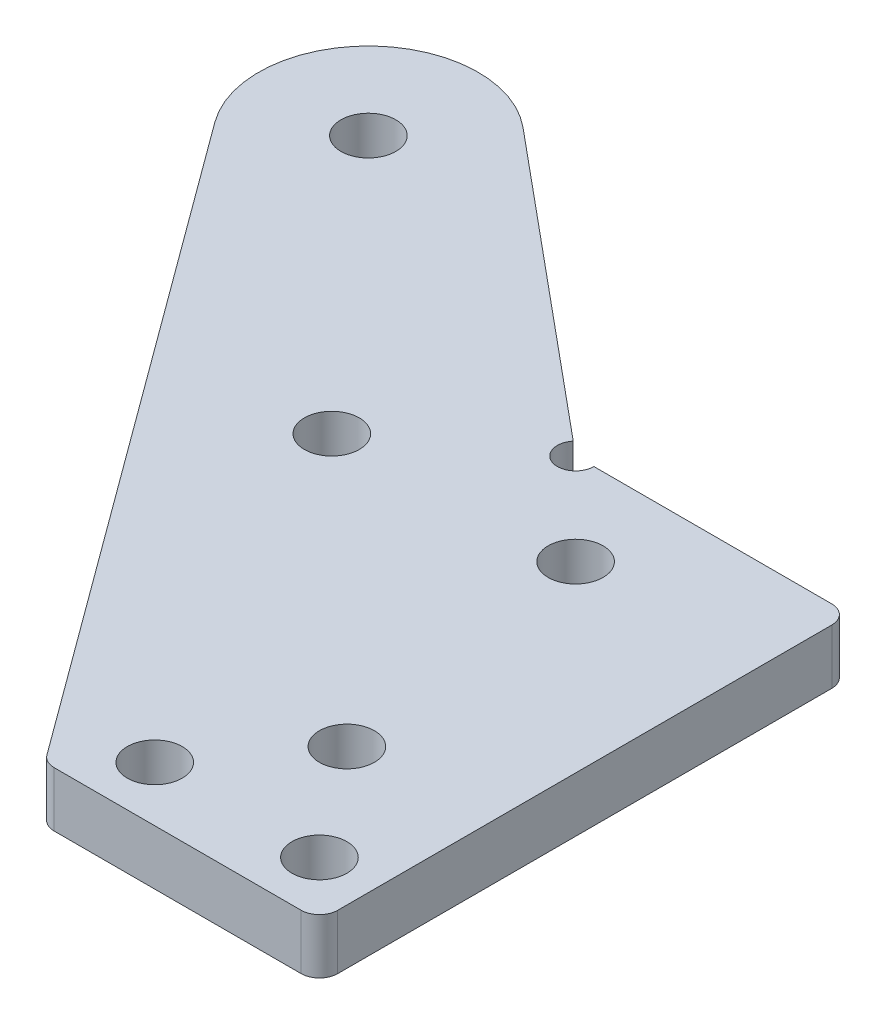
ISO-10303-21;
HEADER;
FILE_DESCRIPTION(('STEP AP214'),'2;1');
FILE_NAME('part.step','',(''),(''),'','','');
FILE_SCHEMA(('AUTOMOTIVE_DESIGN { 1 0 10303 214 1 1 1 1 }'));
ENDSEC;
DATA;
#1=APPLICATION_CONTEXT('core data for automotive mechanical design processes');
#2=APPLICATION_PROTOCOL_DEFINITION('international standard','automotive_design',2000,#1);
#3=PRODUCT_CONTEXT('',#1,'mechanical');
#4=PRODUCT('Part','Part','',(#3));
#5=PRODUCT_RELATED_PRODUCT_CATEGORY('part','',(#4));
#6=PRODUCT_DEFINITION_FORMATION('','',#4);
#7=PRODUCT_DEFINITION_CONTEXT('part definition',#1,'design');
#8=PRODUCT_DEFINITION('design','',#6,#7);
#9=PRODUCT_DEFINITION_SHAPE('','',#8);
#10=(LENGTH_UNIT() NAMED_UNIT(*) SI_UNIT(.MILLI.,.METRE.));
#11=(NAMED_UNIT(*) PLANE_ANGLE_UNIT() SI_UNIT($,.RADIAN.));
#12=(NAMED_UNIT(*) SI_UNIT($,.STERADIAN.) SOLID_ANGLE_UNIT());
#13=UNCERTAINTY_MEASURE_WITH_UNIT(LENGTH_MEASURE(1.E-05),#10,'distance_accuracy_value','');
#14=(GEOMETRIC_REPRESENTATION_CONTEXT(3) GLOBAL_UNCERTAINTY_ASSIGNED_CONTEXT((#13)) GLOBAL_UNIT_ASSIGNED_CONTEXT((#10,
#11,#12)) REPRESENTATION_CONTEXT('',''));
#15=CARTESIAN_POINT('',(0.,0.,0.));
#16=DIRECTION('',(0.,0.,1.));
#17=DIRECTION('',(1.,0.,0.));
#18=AXIS2_PLACEMENT_3D('',#15,#16,#17);
#19=CARTESIAN_POINT('',(-111.825081254808,3.,-50.));
#20=DIRECTION('',(0.,1.,0.));
#21=DIRECTION('',(0.,0.,1.));
#22=AXIS2_PLACEMENT_3D('',#19,#20,#21);
#23=PLANE('',#22);
#24=DIRECTION('',(0.59184614560801,0.,0.806050953680313));
#25=VECTOR('',#24,1.);
#26=CARTESIAN_POINT('',(-116.66138697689,3.,-46.4489231263519));
#27=LINE('',#26,#25);
#28=CARTESIAN_POINT('',(-116.66138697689,3.,-46.4489231263519));
#29=VERTEX_POINT('',#28);
#30=CARTESIAN_POINT('',(-91.2996886045901,3.,-11.908153854392));
#31=VERTEX_POINT('',#30);
#32=EDGE_CURVE('E320',#29,#31,#27,.T.);
#33=ORIENTED_EDGE('',*,*,#32,.T.);
#34=CARTESIAN_POINT('',(-90.4936376509097,3.,-12.5));
#35=DIRECTION('',(0.,1.,0.));
#36=DIRECTION('',(0.,0.,1.));
#37=AXIS2_PLACEMENT_3D('',#34,#35,#36);
#38=CIRCLE('',#37,1.);
#39=CARTESIAN_POINT('',(-90.4936376509097,3.,-11.5));
#40=VERTEX_POINT('',#39);
#41=EDGE_CURVE('E265',#31,#40,#38,.T.);
#42=ORIENTED_EDGE('',*,*,#41,.T.);
#43=DIRECTION('',(1.,0.,0.));
#44=VECTOR('',#43,1.);
#45=CARTESIAN_POINT('',(-76.,3.,-11.5));
#46=LINE('',#45,#44);
#47=CARTESIAN_POINT('',(-77.,3.,-11.5));
#48=VERTEX_POINT('',#47);
#49=EDGE_CURVE('E287',#40,#48,#46,.T.);
#50=ORIENTED_EDGE('',*,*,#49,.T.);
#51=CARTESIAN_POINT('',(-77.,3.,-12.5));
#52=DIRECTION('',(0.,1.,0.));
#53=DIRECTION('',(0.,0.,1.));
#54=AXIS2_PLACEMENT_3D('',#51,#52,#53);
#55=CIRCLE('',#54,1.);
#56=CARTESIAN_POINT('',(-76.,3.,-12.5));
#57=VERTEX_POINT('',#56);
#58=EDGE_CURVE('E261',#48,#57,#55,.T.);
#59=ORIENTED_EDGE('',*,*,#58,.T.);
#60=DIRECTION('',(0.,0.,-1.));
#61=VECTOR('',#60,1.);
#62=CARTESIAN_POINT('',(-76.,3.,-40.5));
#63=LINE('',#62,#61);
#64=CARTESIAN_POINT('',(-76.,3.,-39.5));
#65=VERTEX_POINT('',#64);
#66=EDGE_CURVE('E283',#57,#65,#63,.T.);
#67=ORIENTED_EDGE('',*,*,#66,.T.);
#68=CARTESIAN_POINT('',(-77.,3.,-39.5));
#69=DIRECTION('',(0.,1.,0.));
#70=DIRECTION('',(0.,0.,1.));
#71=AXIS2_PLACEMENT_3D('',#68,#69,#70);
#72=CIRCLE('',#71,1.);
#73=CARTESIAN_POINT('',(-77.,3.,-40.5));
#74=VERTEX_POINT('',#73);
#75=EDGE_CURVE('E63',#65,#74,#72,.T.);
#76=ORIENTED_EDGE('',*,*,#75,.T.);
#77=DIRECTION('',(-1.,0.,0.));
#78=VECTOR('',#77,1.);
#79=CARTESIAN_POINT('',(-91.,3.,-40.5));
#80=LINE('',#79,#78);
#81=CARTESIAN_POINT('',(-90.,3.,-40.5));
#82=VERTEX_POINT('',#81);
#83=EDGE_CURVE('E125',#74,#82,#80,.T.);
#84=ORIENTED_EDGE('',*,*,#83,.T.);
#85=CARTESIAN_POINT('',(-91.,3.,-40.5));
#86=DIRECTION('',(0.,1.,0.));
#87=DIRECTION('',(0.,0.,1.));
#88=AXIS2_PLACEMENT_3D('',#85,#86,#87);
#89=CIRCLE('',#88,0.999999999999998);
#90=CARTESIAN_POINT('',(-91.7691998766931,3.,-41.1390082547943));
#91=VERTEX_POINT('',#90);
#92=EDGE_CURVE('E129',#91,#82,#89,.T.);
#93=ORIENTED_EDGE('',*,*,#92,.F.);
#94=DIRECTION('',(-0.769199876693136,0.,-0.639008254794306));
#95=VECTOR('',#94,1.);
#96=CARTESIAN_POINT('',(-107.991031726043,3.,-54.6151992601588));
#97=LINE('',#96,#95);
#98=CARTESIAN_POINT('',(-107.991031726043,3.,-54.6151992601588));
#99=VERTEX_POINT('',#98);
#100=EDGE_CURVE('E134',#91,#99,#97,.T.);
#101=ORIENTED_EDGE('',*,*,#100,.T.);
#102=CARTESIAN_POINT('',(-111.825081254808,3.,-50.));
#103=DIRECTION('',(0.,1.,0.));
#104=DIRECTION('',(0.,0.,1.));
#105=AXIS2_PLACEMENT_3D('',#102,#103,#104);
#106=CIRCLE('',#105,5.99999999999999);
#107=EDGE_CURVE('E325',#99,#29,#106,.T.);
#108=ORIENTED_EDGE('',*,*,#107,.T.);
#109=EDGE_LOOP('',(#33,#42,#50,#59,#67,#76,#84,#93,#101,#108));
#110=FACE_BOUND('',#109,.T.);
#111=CARTESIAN_POINT('',(-98.7174576696489,3.,-34.8940341603137));
#112=DIRECTION('',(0.,1.,0.));
#113=DIRECTION('',(0.,0.,1.));
#114=AXIS2_PLACEMENT_3D('',#111,#112,#113);
#115=CIRCLE('',#114,1.5);
#116=CARTESIAN_POINT('',(-98.7174576696489,3.,-33.3940341603137));
#117=VERTEX_POINT('',#116);
#118=EDGE_CURVE('E160',#117,#117,#115,.T.);
#119=ORIENTED_EDGE('',*,*,#118,.F.);
#120=EDGE_LOOP('',(#119));
#121=FACE_BOUND('',#120,.T.);
#122=CARTESIAN_POINT('',(-83.5,3.,-20.5));
#123=DIRECTION('',(0.,1.,0.));
#124=DIRECTION('',(0.,0.,1.));
#125=AXIS2_PLACEMENT_3D('',#122,#123,#124);
#126=CIRCLE('',#125,1.5);
#127=CARTESIAN_POINT('',(-83.5,3.,-19.));
#128=VERTEX_POINT('',#127);
#129=EDGE_CURVE('E175',#128,#128,#126,.T.);
#130=ORIENTED_EDGE('',*,*,#129,.F.);
#131=EDGE_LOOP('',(#130));
#132=FACE_BOUND('',#131,.T.);
#133=CARTESIAN_POINT('',(-88.,3.,-14.5));
#134=DIRECTION('',(0.,1.,0.));
#135=DIRECTION('',(0.,0.,1.));
#136=AXIS2_PLACEMENT_3D('',#133,#134,#135);
#137=CIRCLE('',#136,1.5);
#138=CARTESIAN_POINT('',(-88.,3.,-13.));
#139=VERTEX_POINT('',#138);
#140=EDGE_CURVE('E292',#139,#139,#137,.T.);
#141=ORIENTED_EDGE('',*,*,#140,.F.);
#142=EDGE_LOOP('',(#141));
#143=FACE_BOUND('',#142,.T.);
#144=CARTESIAN_POINT('',(-79.,3.,-14.5));
#145=DIRECTION('',(0.,1.,0.));
#146=DIRECTION('',(0.,0.,1.));
#147=AXIS2_PLACEMENT_3D('',#144,#145,#146);
#148=CIRCLE('',#147,1.5);
#149=CARTESIAN_POINT('',(-79.,3.,-13.));
#150=VERTEX_POINT('',#149);
#151=EDGE_CURVE('E185',#150,#150,#148,.T.);
#152=ORIENTED_EDGE('',*,*,#151,.F.);
#153=EDGE_LOOP('',(#152));
#154=FACE_BOUND('',#153,.T.);
#155=CARTESIAN_POINT('',(-86.,3.,-35.5));
#156=DIRECTION('',(0.,1.,0.));
#157=DIRECTION('',(0.,0.,1.));
#158=AXIS2_PLACEMENT_3D('',#155,#156,#157);
#159=CIRCLE('',#158,1.5);
#160=CARTESIAN_POINT('',(-86.,3.,-34.));
#161=VERTEX_POINT('',#160);
#162=EDGE_CURVE('E184',#161,#161,#159,.T.);
#163=ORIENTED_EDGE('',*,*,#162,.F.);
#164=EDGE_LOOP('',(#163));
#165=FACE_BOUND('',#164,.T.);
#166=CARTESIAN_POINT('',(-111.825081254808,3.,-50.));
#167=DIRECTION('',(0.,1.,0.));
#168=DIRECTION('',(0.,0.,1.));
#169=AXIS2_PLACEMENT_3D('',#166,#167,#168);
#170=CIRCLE('',#169,1.5);
#171=CARTESIAN_POINT('',(-111.825081254808,3.,-48.5));
#172=VERTEX_POINT('',#171);
#173=EDGE_CURVE('E152',#172,#172,#170,.T.);
#174=ORIENTED_EDGE('',*,*,#173,.F.);
#175=EDGE_LOOP('',(#174));
#176=FACE_BOUND('',#175,.T.);
#177=ADVANCED_FACE('F48',(#110,#121,#132,#143,#154,#165,#176),#23,.T.);
#178=CARTESIAN_POINT('',(-111.825081254808,0.,-50.));
#179=DIRECTION('',(0.,1.,0.));
#180=DIRECTION('',(0.,0.,1.));
#181=AXIS2_PLACEMENT_3D('',#178,#179,#180);
#182=PLANE('',#181);
#183=DIRECTION('',(1.,0.,0.));
#184=VECTOR('',#183,1.);
#185=CARTESIAN_POINT('',(-76.,0.,-11.5));
#186=LINE('',#185,#184);
#187=CARTESIAN_POINT('',(-90.4936376509097,0.,-11.5));
#188=VERTEX_POINT('',#187);
#189=CARTESIAN_POINT('',(-77.,0.,-11.5));
#190=VERTEX_POINT('',#189);
#191=EDGE_CURVE('E299',#188,#190,#186,.T.);
#192=ORIENTED_EDGE('',*,*,#191,.F.);
#193=CARTESIAN_POINT('',(-90.4936376509097,0.,-12.5));
#194=DIRECTION('',(0.,1.,0.));
#195=DIRECTION('',(0.,0.,1.));
#196=AXIS2_PLACEMENT_3D('',#193,#194,#195);
#197=CIRCLE('',#196,1.);
#198=CARTESIAN_POINT('',(-91.2996886045901,0.,-11.908153854392));
#199=VERTEX_POINT('',#198);
#200=EDGE_CURVE('E317',#188,#199,#197,.F.);
#201=ORIENTED_EDGE('',*,*,#200,.T.);
#202=DIRECTION('',(0.59184614560801,0.,0.806050953680313));
#203=VECTOR('',#202,1.);
#204=CARTESIAN_POINT('',(-116.66138697689,0.,-46.4489231263519));
#205=LINE('',#204,#203);
#206=CARTESIAN_POINT('',(-116.66138697689,0.,-46.4489231263519));
#207=VERTEX_POINT('',#206);
#208=EDGE_CURVE('E296',#207,#199,#205,.T.);
#209=ORIENTED_EDGE('',*,*,#208,.F.);
#210=CARTESIAN_POINT('',(-111.825081254808,0.,-50.));
#211=DIRECTION('',(0.,1.,0.));
#212=DIRECTION('',(0.,0.,1.));
#213=AXIS2_PLACEMENT_3D('',#210,#211,#212);
#214=CIRCLE('',#213,5.99999999999999);
#215=CARTESIAN_POINT('',(-107.991031726043,0.,-54.6151992601588));
#216=VERTEX_POINT('',#215);
#217=EDGE_CURVE('E294',#216,#207,#214,.T.);
#218=ORIENTED_EDGE('',*,*,#217,.F.);
#219=DIRECTION('',(-0.769199876693136,0.,-0.639008254794306));
#220=VECTOR('',#219,1.);
#221=CARTESIAN_POINT('',(-107.991031726043,0.,-54.6151992601588));
#222=LINE('',#221,#220);
#223=CARTESIAN_POINT('',(-91.7691998766931,0.,-41.1390082547943));
#224=VERTEX_POINT('',#223);
#225=EDGE_CURVE('E291',#224,#216,#222,.T.);
#226=ORIENTED_EDGE('',*,*,#225,.F.);
#227=CARTESIAN_POINT('',(-91.,0.,-40.5));
#228=DIRECTION('',(0.,1.,0.));
#229=DIRECTION('',(0.,0.,1.));
#230=AXIS2_PLACEMENT_3D('',#227,#228,#229);
#231=CIRCLE('',#230,0.999999999999998);
#232=CARTESIAN_POINT('',(-90.,0.,-40.5));
#233=VERTEX_POINT('',#232);
#234=EDGE_CURVE('E144',#224,#233,#231,.T.);
#235=ORIENTED_EDGE('',*,*,#234,.T.);
#236=DIRECTION('',(-1.,0.,0.));
#237=VECTOR('',#236,1.);
#238=CARTESIAN_POINT('',(-91.,0.,-40.5));
#239=LINE('',#238,#237);
#240=CARTESIAN_POINT('',(-77.,0.,-40.5));
#241=VERTEX_POINT('',#240);
#242=EDGE_CURVE('E148',#241,#233,#239,.T.);
#243=ORIENTED_EDGE('',*,*,#242,.F.);
#244=CARTESIAN_POINT('',(-77.,0.,-39.5));
#245=DIRECTION('',(0.,1.,0.));
#246=DIRECTION('',(0.,0.,1.));
#247=AXIS2_PLACEMENT_3D('',#244,#245,#246);
#248=CIRCLE('',#247,1.);
#249=CARTESIAN_POINT('',(-76.,0.,-39.5));
#250=VERTEX_POINT('',#249);
#251=EDGE_CURVE('E313',#241,#250,#248,.F.);
#252=ORIENTED_EDGE('',*,*,#251,.T.);
#253=DIRECTION('',(0.,0.,-1.));
#254=VECTOR('',#253,1.);
#255=CARTESIAN_POINT('',(-76.,0.,-40.5));
#256=LINE('',#255,#254);
#257=CARTESIAN_POINT('',(-76.,0.,-12.5));
#258=VERTEX_POINT('',#257);
#259=EDGE_CURVE('E135',#258,#250,#256,.T.);
#260=ORIENTED_EDGE('',*,*,#259,.F.);
#261=CARTESIAN_POINT('',(-77.,0.,-12.5));
#262=DIRECTION('',(0.,1.,0.));
#263=DIRECTION('',(0.,0.,1.));
#264=AXIS2_PLACEMENT_3D('',#261,#262,#263);
#265=CIRCLE('',#264,1.);
#266=EDGE_CURVE('E315',#258,#190,#265,.F.);
#267=ORIENTED_EDGE('',*,*,#266,.T.);
#268=EDGE_LOOP('',(#192,#201,#209,#218,#226,#235,#243,#252,#260,#267));
#269=FACE_BOUND('',#268,.T.);
#270=CARTESIAN_POINT('',(-88.,0.,-14.5));
#271=DIRECTION('',(0.,1.,0.));
#272=DIRECTION('',(0.,0.,1.));
#273=AXIS2_PLACEMENT_3D('',#270,#271,#272);
#274=CIRCLE('',#273,1.5);
#275=CARTESIAN_POINT('',(-88.,0.,-13.));
#276=VERTEX_POINT('',#275);
#277=EDGE_CURVE('E189',#276,#276,#274,.T.);
#278=ORIENTED_EDGE('',*,*,#277,.T.);
#279=EDGE_LOOP('',(#278));
#280=FACE_BOUND('',#279,.T.);
#281=CARTESIAN_POINT('',(-79.,0.,-14.5));
#282=DIRECTION('',(0.,1.,0.));
#283=DIRECTION('',(0.,0.,1.));
#284=AXIS2_PLACEMENT_3D('',#281,#282,#283);
#285=CIRCLE('',#284,1.5);
#286=CARTESIAN_POINT('',(-79.,0.,-13.));
#287=VERTEX_POINT('',#286);
#288=EDGE_CURVE('E180',#287,#287,#285,.T.);
#289=ORIENTED_EDGE('',*,*,#288,.T.);
#290=EDGE_LOOP('',(#289));
#291=FACE_BOUND('',#290,.T.);
#292=CARTESIAN_POINT('',(-83.5,0.,-20.5));
#293=DIRECTION('',(0.,1.,0.));
#294=DIRECTION('',(0.,0.,1.));
#295=AXIS2_PLACEMENT_3D('',#292,#293,#294);
#296=CIRCLE('',#295,1.5);
#297=CARTESIAN_POINT('',(-83.5,0.,-19.));
#298=VERTEX_POINT('',#297);
#299=EDGE_CURVE('E181',#298,#298,#296,.T.);
#300=ORIENTED_EDGE('',*,*,#299,.T.);
#301=EDGE_LOOP('',(#300));
#302=FACE_BOUND('',#301,.T.);
#303=CARTESIAN_POINT('',(-86.,0.,-35.5));
#304=DIRECTION('',(0.,1.,0.));
#305=DIRECTION('',(0.,0.,1.));
#306=AXIS2_PLACEMENT_3D('',#303,#304,#305);
#307=CIRCLE('',#306,1.5);
#308=CARTESIAN_POINT('',(-86.,0.,-34.));
#309=VERTEX_POINT('',#308);
#310=EDGE_CURVE('E164',#309,#309,#307,.T.);
#311=ORIENTED_EDGE('',*,*,#310,.T.);
#312=EDGE_LOOP('',(#311));
#313=FACE_BOUND('',#312,.T.);
#314=CARTESIAN_POINT('',(-98.7174576696489,0.,-34.8940341603137));
#315=DIRECTION('',(0.,1.,0.));
#316=DIRECTION('',(0.,0.,1.));
#317=AXIS2_PLACEMENT_3D('',#314,#315,#316);
#318=CIRCLE('',#317,1.5);
#319=CARTESIAN_POINT('',(-98.7174576696489,0.,-33.3940341603137));
#320=VERTEX_POINT('',#319);
#321=EDGE_CURVE('E158',#320,#320,#318,.T.);
#322=ORIENTED_EDGE('',*,*,#321,.T.);
#323=EDGE_LOOP('',(#322));
#324=FACE_BOUND('',#323,.T.);
#325=CARTESIAN_POINT('',(-111.825081254808,0.,-50.));
#326=DIRECTION('',(0.,1.,0.));
#327=DIRECTION('',(0.,0.,1.));
#328=AXIS2_PLACEMENT_3D('',#325,#326,#327);
#329=CIRCLE('',#328,1.5);
#330=CARTESIAN_POINT('',(-111.825081254808,0.,-48.5));
#331=VERTEX_POINT('',#330);
#332=EDGE_CURVE('E149',#331,#331,#329,.T.);
#333=ORIENTED_EDGE('',*,*,#332,.T.);
#334=EDGE_LOOP('',(#333));
#335=FACE_BOUND('',#334,.T.);
#336=ADVANCED_FACE('F197',(#269,#280,#291,#302,#313,#324,#335),#182,.F.);
#337=CARTESIAN_POINT('',(-91.,3.,-40.5));
#338=DIRECTION('',(0.,0.,1.));
#339=DIRECTION('',(1.,0.,0.));
#340=AXIS2_PLACEMENT_3D('',#337,#338,#339);
#341=PLANE('',#340);
#342=ORIENTED_EDGE('',*,*,#83,.F.);
#343=DIRECTION('',(0.,-1.,0.));
#344=VECTOR('',#343,1.);
#345=CARTESIAN_POINT('',(-77.,3.,-40.5));
#346=LINE('',#345,#344);
#347=EDGE_CURVE('E12',#74,#241,#346,.T.);
#348=ORIENTED_EDGE('',*,*,#347,.T.);
#349=ORIENTED_EDGE('',*,*,#242,.T.);
#350=DIRECTION('',(0.,1.,0.));
#351=VECTOR('',#350,1.);
#352=CARTESIAN_POINT('',(-90.,0.,-40.5));
#353=LINE('',#352,#351);
#354=EDGE_CURVE('E140',#233,#82,#353,.T.);
#355=ORIENTED_EDGE('',*,*,#354,.T.);
#356=EDGE_LOOP('',(#342,#348,#349,#355));
#357=FACE_BOUND('',#356,.T.);
#358=ADVANCED_FACE('F146',(#357),#341,.F.);
#359=CARTESIAN_POINT('',(-107.991031726043,3.,-54.6151992601588));
#360=DIRECTION('',(-0.639008254794306,0.,0.769199876693136));
#361=DIRECTION('',(0.769199876693136,0.,0.639008254794306));
#362=AXIS2_PLACEMENT_3D('',#359,#360,#361);
#363=PLANE('',#362);
#364=ORIENTED_EDGE('',*,*,#100,.F.);
#365=DIRECTION('',(0.,1.,0.));
#366=VECTOR('',#365,1.);
#367=CARTESIAN_POINT('',(-91.7691998766931,0.,-41.1390082547943));
#368=LINE('',#367,#366);
#369=EDGE_CURVE('E143',#91,#224,#368,.F.);
#370=ORIENTED_EDGE('',*,*,#369,.T.);
#371=ORIENTED_EDGE('',*,*,#225,.T.);
#372=DIRECTION('',(0.,-1.,0.));
#373=VECTOR('',#372,1.);
#374=CARTESIAN_POINT('',(-107.991031726043,3.,-54.6151992601588));
#375=LINE('',#374,#373);
#376=EDGE_CURVE('E305',#99,#216,#375,.T.);
#377=ORIENTED_EDGE('',*,*,#376,.F.);
#378=EDGE_LOOP('',(#364,#370,#371,#377));
#379=FACE_BOUND('',#378,.T.);
#380=ADVANCED_FACE('F241',(#379),#363,.F.);
#381=CARTESIAN_POINT('',(-111.825081254808,3.,-50.));
#382=DIRECTION('',(0.,-1.,0.));
#383=DIRECTION('',(0.,0.,-1.));
#384=AXIS2_PLACEMENT_3D('',#381,#382,#383);
#385=CYLINDRICAL_SURFACE('',#384,5.99999999999999);
#386=ORIENTED_EDGE('',*,*,#217,.T.);
#387=DIRECTION('',(0.,-1.,0.));
#388=VECTOR('',#387,1.);
#389=CARTESIAN_POINT('',(-116.66138697689,3.,-46.4489231263519));
#390=LINE('',#389,#388);
#391=EDGE_CURVE('E286',#29,#207,#390,.T.);
#392=ORIENTED_EDGE('',*,*,#391,.F.);
#393=ORIENTED_EDGE('',*,*,#107,.F.);
#394=ORIENTED_EDGE('',*,*,#376,.T.);
#395=EDGE_LOOP('',(#386,#392,#393,#394));
#396=FACE_BOUND('',#395,.T.);
#397=ADVANCED_FACE('F237',(#396),#385,.T.);
#398=CARTESIAN_POINT('',(-116.66138697689,3.,-46.4489231263519));
#399=DIRECTION('',(0.806050953680313,0.,-0.59184614560801));
#400=DIRECTION('',(-0.59184614560801,0.,-0.806050953680313));
#401=AXIS2_PLACEMENT_3D('',#398,#399,#400);
#402=PLANE('',#401);
#403=ORIENTED_EDGE('',*,*,#208,.T.);
#404=DIRECTION('',(0.,-1.,0.));
#405=VECTOR('',#404,1.);
#406=CARTESIAN_POINT('',(-91.29968860459,3.,-11.908153854392));
#407=LINE('',#406,#405);
#408=EDGE_CURVE('E268',#199,#31,#407,.F.);
#409=ORIENTED_EDGE('',*,*,#408,.T.);
#410=ORIENTED_EDGE('',*,*,#32,.F.);
#411=ORIENTED_EDGE('',*,*,#391,.T.);
#412=EDGE_LOOP('',(#403,#409,#410,#411));
#413=FACE_BOUND('',#412,.T.);
#414=ADVANCED_FACE('F233',(#413),#402,.F.);
#415=CARTESIAN_POINT('',(-76.,3.,-11.5));
#416=DIRECTION('',(0.,0.,-1.));
#417=DIRECTION('',(-1.,0.,0.));
#418=AXIS2_PLACEMENT_3D('',#415,#416,#417);
#419=PLANE('',#418);
#420=ORIENTED_EDGE('',*,*,#49,.F.);
#421=DIRECTION('',(0.,-1.,0.));
#422=VECTOR('',#421,1.);
#423=CARTESIAN_POINT('',(-90.4936376509097,3.,-11.5));
#424=LINE('',#423,#422);
#425=EDGE_CURVE('E310',#40,#188,#424,.T.);
#426=ORIENTED_EDGE('',*,*,#425,.T.);
#427=ORIENTED_EDGE('',*,*,#191,.T.);
#428=DIRECTION('',(0.,-1.,0.));
#429=VECTOR('',#428,1.);
#430=CARTESIAN_POINT('',(-77.,3.,-11.5));
#431=LINE('',#430,#429);
#432=EDGE_CURVE('E262',#190,#48,#431,.F.);
#433=ORIENTED_EDGE('',*,*,#432,.T.);
#434=EDGE_LOOP('',(#420,#426,#427,#433));
#435=FACE_BOUND('',#434,.T.);
#436=ADVANCED_FACE('F230',(#435),#419,.F.);
#437=CARTESIAN_POINT('',(-76.,3.,-40.5));
#438=DIRECTION('',(-1.,0.,0.));
#439=DIRECTION('',(0.,0.,1.));
#440=AXIS2_PLACEMENT_3D('',#437,#438,#439);
#441=PLANE('',#440);
#442=ORIENTED_EDGE('',*,*,#66,.F.);
#443=DIRECTION('',(0.,-1.,0.));
#444=VECTOR('',#443,1.);
#445=CARTESIAN_POINT('',(-76.,3.,-12.5));
#446=LINE('',#445,#444);
#447=EDGE_CURVE('E56',#57,#258,#446,.T.);
#448=ORIENTED_EDGE('',*,*,#447,.T.);
#449=ORIENTED_EDGE('',*,*,#259,.T.);
#450=DIRECTION('',(0.,-1.,0.));
#451=VECTOR('',#450,1.);
#452=CARTESIAN_POINT('',(-76.,3.,-39.5));
#453=LINE('',#452,#451);
#454=EDGE_CURVE('E71',#250,#65,#453,.F.);
#455=ORIENTED_EDGE('',*,*,#454,.T.);
#456=EDGE_LOOP('',(#442,#448,#449,#455));
#457=FACE_BOUND('',#456,.T.);
#458=ADVANCED_FACE('F227',(#457),#441,.F.);
#459=CARTESIAN_POINT('',(-88.,3.,-14.5));
#460=DIRECTION('',(0.,-1.,0.));
#461=DIRECTION('',(0.,0.,-1.));
#462=AXIS2_PLACEMENT_3D('',#459,#460,#461);
#463=CYLINDRICAL_SURFACE('',#462,1.5);
#464=ORIENTED_EDGE('',*,*,#140,.T.);
#465=EDGE_LOOP('',(#464));
#466=FACE_BOUND('',#465,.T.);
#467=ORIENTED_EDGE('',*,*,#277,.F.);
#468=EDGE_LOOP('',(#467));
#469=FACE_BOUND('',#468,.T.);
#470=ADVANCED_FACE('F224',(#466,#469),#463,.F.);
#471=CARTESIAN_POINT('',(-79.,3.,-14.5));
#472=DIRECTION('',(0.,-1.,0.));
#473=DIRECTION('',(0.,0.,-1.));
#474=AXIS2_PLACEMENT_3D('',#471,#472,#473);
#475=CYLINDRICAL_SURFACE('',#474,1.5);
#476=ORIENTED_EDGE('',*,*,#151,.T.);
#477=EDGE_LOOP('',(#476));
#478=FACE_BOUND('',#477,.T.);
#479=ORIENTED_EDGE('',*,*,#288,.F.);
#480=EDGE_LOOP('',(#479));
#481=FACE_BOUND('',#480,.T.);
#482=ADVANCED_FACE('F212',(#478,#481),#475,.F.);
#483=CARTESIAN_POINT('',(-83.5,3.,-20.5));
#484=DIRECTION('',(0.,-1.,0.));
#485=DIRECTION('',(0.,0.,-1.));
#486=AXIS2_PLACEMENT_3D('',#483,#484,#485);
#487=CYLINDRICAL_SURFACE('',#486,1.5);
#488=ORIENTED_EDGE('',*,*,#129,.T.);
#489=EDGE_LOOP('',(#488));
#490=FACE_BOUND('',#489,.T.);
#491=ORIENTED_EDGE('',*,*,#299,.F.);
#492=EDGE_LOOP('',(#491));
#493=FACE_BOUND('',#492,.T.);
#494=ADVANCED_FACE('F203',(#490,#493),#487,.F.);
#495=CARTESIAN_POINT('',(-86.,3.,-35.5));
#496=DIRECTION('',(0.,-1.,0.));
#497=DIRECTION('',(0.,0.,-1.));
#498=AXIS2_PLACEMENT_3D('',#495,#496,#497);
#499=CYLINDRICAL_SURFACE('',#498,1.5);
#500=ORIENTED_EDGE('',*,*,#162,.T.);
#501=EDGE_LOOP('',(#500));
#502=FACE_BOUND('',#501,.T.);
#503=ORIENTED_EDGE('',*,*,#310,.F.);
#504=EDGE_LOOP('',(#503));
#505=FACE_BOUND('',#504,.T.);
#506=ADVANCED_FACE('F200',(#502,#505),#499,.F.);
#507=CARTESIAN_POINT('',(-98.7174576696489,3.,-34.8940341603137));
#508=DIRECTION('',(0.,-1.,0.));
#509=DIRECTION('',(0.,0.,-1.));
#510=AXIS2_PLACEMENT_3D('',#507,#508,#509);
#511=CYLINDRICAL_SURFACE('',#510,1.5);
#512=ORIENTED_EDGE('',*,*,#118,.T.);
#513=EDGE_LOOP('',(#512));
#514=FACE_BOUND('',#513,.T.);
#515=ORIENTED_EDGE('',*,*,#321,.F.);
#516=EDGE_LOOP('',(#515));
#517=FACE_BOUND('',#516,.T.);
#518=ADVANCED_FACE('F202',(#514,#517),#511,.F.);
#519=CARTESIAN_POINT('',(-111.825081254808,3.,-50.));
#520=DIRECTION('',(0.,-1.,0.));
#521=DIRECTION('',(0.,0.,-1.));
#522=AXIS2_PLACEMENT_3D('',#519,#520,#521);
#523=CYLINDRICAL_SURFACE('',#522,1.5);
#524=ORIENTED_EDGE('',*,*,#173,.T.);
#525=EDGE_LOOP('',(#524));
#526=FACE_BOUND('',#525,.T.);
#527=ORIENTED_EDGE('',*,*,#332,.F.);
#528=EDGE_LOOP('',(#527));
#529=FACE_BOUND('',#528,.T.);
#530=ADVANCED_FACE('F209',(#526,#529),#523,.F.);
#531=CARTESIAN_POINT('',(-91.,0.,-40.5));
#532=DIRECTION('',(0.,1.,0.));
#533=DIRECTION('',(0.,0.,1.));
#534=AXIS2_PLACEMENT_3D('',#531,#532,#533);
#535=CYLINDRICAL_SURFACE('',#534,0.999999999999998);
#536=ORIENTED_EDGE('',*,*,#234,.F.);
#537=ORIENTED_EDGE('',*,*,#369,.F.);
#538=ORIENTED_EDGE('',*,*,#92,.T.);
#539=ORIENTED_EDGE('',*,*,#354,.F.);
#540=EDGE_LOOP('',(#536,#537,#538,#539));
#541=FACE_BOUND('',#540,.T.);
#542=ADVANCED_FACE('F139',(#541),#535,.F.);
#543=CARTESIAN_POINT('',(-90.4936376509097,3.,-12.5));
#544=DIRECTION('',(0.,-1.,0.));
#545=DIRECTION('',(0.,0.,-1.));
#546=AXIS2_PLACEMENT_3D('',#543,#544,#545);
#547=CYLINDRICAL_SURFACE('',#546,1.);
#548=ORIENTED_EDGE('',*,*,#41,.F.);
#549=ORIENTED_EDGE('',*,*,#408,.F.);
#550=ORIENTED_EDGE('',*,*,#200,.F.);
#551=ORIENTED_EDGE('',*,*,#425,.F.);
#552=EDGE_LOOP('',(#548,#549,#550,#551));
#553=FACE_BOUND('',#552,.T.);
#554=ADVANCED_FACE('F248',(#553),#547,.T.);
#555=CARTESIAN_POINT('',(-77.,3.,-12.5));
#556=DIRECTION('',(0.,-1.,0.));
#557=DIRECTION('',(0.,0.,-1.));
#558=AXIS2_PLACEMENT_3D('',#555,#556,#557);
#559=CYLINDRICAL_SURFACE('',#558,1.);
#560=ORIENTED_EDGE('',*,*,#58,.F.);
#561=ORIENTED_EDGE('',*,*,#432,.F.);
#562=ORIENTED_EDGE('',*,*,#266,.F.);
#563=ORIENTED_EDGE('',*,*,#447,.F.);
#564=EDGE_LOOP('',(#560,#561,#562,#563));
#565=FACE_BOUND('',#564,.T.);
#566=ADVANCED_FACE('F250',(#565),#559,.T.);
#567=CARTESIAN_POINT('',(-77.,3.,-39.5));
#568=DIRECTION('',(0.,-1.,0.));
#569=DIRECTION('',(0.,0.,-1.));
#570=AXIS2_PLACEMENT_3D('',#567,#568,#569);
#571=CYLINDRICAL_SURFACE('',#570,1.);
#572=ORIENTED_EDGE('',*,*,#75,.F.);
#573=ORIENTED_EDGE('',*,*,#454,.F.);
#574=ORIENTED_EDGE('',*,*,#251,.F.);
#575=ORIENTED_EDGE('',*,*,#347,.F.);
#576=EDGE_LOOP('',(#572,#573,#574,#575));
#577=FACE_BOUND('',#576,.T.);
#578=ADVANCED_FACE('F50',(#577),#571,.T.);
#579=CLOSED_SHELL('',(#177,#336,#358,#380,#397,#414,#436,#458,#470,#482,#494,#506,#518,#530,
#542,#554,#566,#578));
#580=MANIFOLD_SOLID_BREP('B2',#579);
#581=ADVANCED_BREP_SHAPE_REPRESENTATION('',(#18,#580),#14);
#582=SHAPE_DEFINITION_REPRESENTATION(#9,#581);
ENDSEC;
END-ISO-10303-21;
